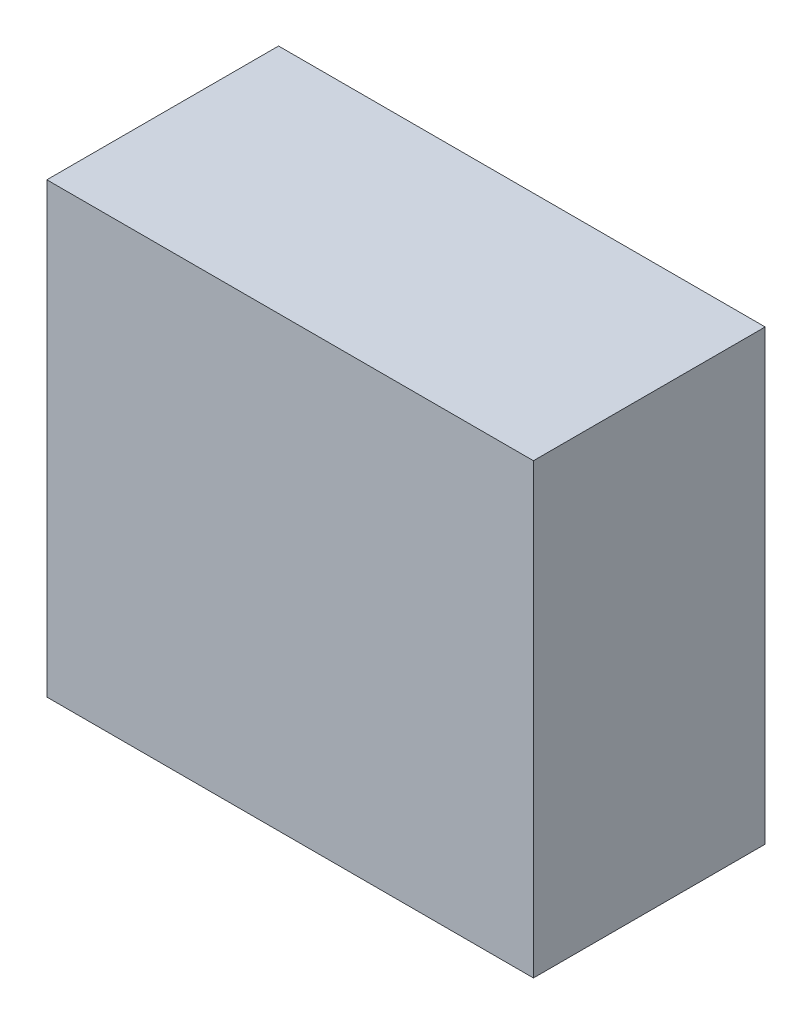
ISO-10303-21;
HEADER;
FILE_DESCRIPTION(('STEP AP214'),'2;1');
FILE_NAME('part.step','',(''),(''),'','','');
FILE_SCHEMA(('AUTOMOTIVE_DESIGN { 1 0 10303 214 1 1 1 1 }'));
ENDSEC;
DATA;
#1=APPLICATION_CONTEXT('core data for automotive mechanical design processes');
#2=APPLICATION_PROTOCOL_DEFINITION('international standard','automotive_design',2000,#1);
#3=PRODUCT_CONTEXT('',#1,'mechanical');
#4=PRODUCT('Part','Part','',(#3));
#5=PRODUCT_RELATED_PRODUCT_CATEGORY('part','',(#4));
#6=PRODUCT_DEFINITION_FORMATION('','',#4);
#7=PRODUCT_DEFINITION_CONTEXT('part definition',#1,'design');
#8=PRODUCT_DEFINITION('design','',#6,#7);
#9=PRODUCT_DEFINITION_SHAPE('','',#8);
#10=(LENGTH_UNIT() NAMED_UNIT(*) SI_UNIT(.MILLI.,.METRE.));
#11=(NAMED_UNIT(*) PLANE_ANGLE_UNIT() SI_UNIT($,.RADIAN.));
#12=(NAMED_UNIT(*) SI_UNIT($,.STERADIAN.) SOLID_ANGLE_UNIT());
#13=UNCERTAINTY_MEASURE_WITH_UNIT(LENGTH_MEASURE(1.E-05),#10,'distance_accuracy_value','');
#14=(GEOMETRIC_REPRESENTATION_CONTEXT(3) GLOBAL_UNCERTAINTY_ASSIGNED_CONTEXT((#13)) GLOBAL_UNIT_ASSIGNED_CONTEXT((#10,
#11,#12)) REPRESENTATION_CONTEXT('',''));
#15=CARTESIAN_POINT('',(0.,0.,0.));
#16=DIRECTION('',(0.,0.,1.));
#17=DIRECTION('',(1.,0.,0.));
#18=AXIS2_PLACEMENT_3D('',#15,#16,#17);
#19=CARTESIAN_POINT('',(31.5,29.,30.));
#20=DIRECTION('',(-1.,0.,0.));
#21=DIRECTION('',(0.,0.,1.));
#22=AXIS2_PLACEMENT_3D('',#19,#20,#21);
#23=PLANE('',#22);
#24=DIRECTION('',(0.,1.,0.));
#25=VECTOR('',#24,1.);
#26=CARTESIAN_POINT('',(31.5,29.,0.));
#27=LINE('',#26,#25);
#28=CARTESIAN_POINT('',(31.5,-29.,0.));
#29=VERTEX_POINT('',#28);
#30=CARTESIAN_POINT('',(31.5,29.,0.));
#31=VERTEX_POINT('',#30);
#32=EDGE_CURVE('E100',#29,#31,#27,.T.);
#33=ORIENTED_EDGE('',*,*,#32,.T.);
#34=DIRECTION('',(0.,0.,-1.));
#35=VECTOR('',#34,1.);
#36=CARTESIAN_POINT('',(31.5,29.,30.));
#37=LINE('',#36,#35);
#38=CARTESIAN_POINT('',(31.5,29.,30.));
#39=VERTEX_POINT('',#38);
#40=EDGE_CURVE('E11',#39,#31,#37,.T.);
#41=ORIENTED_EDGE('',*,*,#40,.F.);
#42=DIRECTION('',(0.,1.,0.));
#43=VECTOR('',#42,1.);
#44=CARTESIAN_POINT('',(31.5,29.,30.));
#45=LINE('',#44,#43);
#46=CARTESIAN_POINT('',(31.5,-29.,30.));
#47=VERTEX_POINT('',#46);
#48=EDGE_CURVE('E88',#47,#39,#45,.T.);
#49=ORIENTED_EDGE('',*,*,#48,.F.);
#50=DIRECTION('',(0.,0.,-1.));
#51=VECTOR('',#50,1.);
#52=CARTESIAN_POINT('',(31.5,-29.,30.));
#53=LINE('',#52,#51);
#54=EDGE_CURVE('E96',#47,#29,#53,.T.);
#55=ORIENTED_EDGE('',*,*,#54,.T.);
#56=EDGE_LOOP('',(#33,#41,#49,#55));
#57=FACE_BOUND('',#56,.T.);
#58=ADVANCED_FACE('F37',(#57),#23,.F.);
#59=CARTESIAN_POINT('',(-31.5,29.,30.));
#60=DIRECTION('',(0.,-1.,0.));
#61=DIRECTION('',(0.,0.,-1.));
#62=AXIS2_PLACEMENT_3D('',#59,#60,#61);
#63=PLANE('',#62);
#64=DIRECTION('',(-1.,0.,0.));
#65=VECTOR('',#64,1.);
#66=CARTESIAN_POINT('',(-31.5,29.,0.));
#67=LINE('',#66,#65);
#68=CARTESIAN_POINT('',(-31.5,29.,0.));
#69=VERTEX_POINT('',#68);
#70=EDGE_CURVE('E92',#31,#69,#67,.T.);
#71=ORIENTED_EDGE('',*,*,#70,.T.);
#72=DIRECTION('',(0.,0.,-1.));
#73=VECTOR('',#72,1.);
#74=CARTESIAN_POINT('',(-31.5,29.,30.));
#75=LINE('',#74,#73);
#76=CARTESIAN_POINT('',(-31.5,29.,30.));
#77=VERTEX_POINT('',#76);
#78=EDGE_CURVE('E45',#77,#69,#75,.T.);
#79=ORIENTED_EDGE('',*,*,#78,.F.);
#80=DIRECTION('',(-1.,0.,0.));
#81=VECTOR('',#80,1.);
#82=CARTESIAN_POINT('',(-31.5,29.,30.));
#83=LINE('',#82,#81);
#84=EDGE_CURVE('E83',#39,#77,#83,.T.);
#85=ORIENTED_EDGE('',*,*,#84,.F.);
#86=ORIENTED_EDGE('',*,*,#40,.T.);
#87=EDGE_LOOP('',(#71,#79,#85,#86));
#88=FACE_BOUND('',#87,.T.);
#89=ADVANCED_FACE('F91',(#88),#63,.F.);
#90=CARTESIAN_POINT('',(-31.5,29.,30.));
#91=DIRECTION('',(1.,0.,0.));
#92=DIRECTION('',(0.,0.,-1.));
#93=AXIS2_PLACEMENT_3D('',#90,#91,#92);
#94=PLANE('',#93);
#95=DIRECTION('',(0.,-1.,0.));
#96=VECTOR('',#95,1.);
#97=CARTESIAN_POINT('',(-31.5,29.,0.));
#98=LINE('',#97,#96);
#99=CARTESIAN_POINT('',(-31.5,-29.,0.));
#100=VERTEX_POINT('',#99);
#101=EDGE_CURVE('E70',#69,#100,#98,.T.);
#102=ORIENTED_EDGE('',*,*,#101,.T.);
#103=DIRECTION('',(0.,0.,-1.));
#104=VECTOR('',#103,1.);
#105=CARTESIAN_POINT('',(-31.5,-29.,30.));
#106=LINE('',#105,#104);
#107=CARTESIAN_POINT('',(-31.5,-29.,30.));
#108=VERTEX_POINT('',#107);
#109=EDGE_CURVE('E93',#108,#100,#106,.T.);
#110=ORIENTED_EDGE('',*,*,#109,.F.);
#111=DIRECTION('',(0.,-1.,0.));
#112=VECTOR('',#111,1.);
#113=CARTESIAN_POINT('',(-31.5,29.,30.));
#114=LINE('',#113,#112);
#115=EDGE_CURVE('E86',#77,#108,#114,.T.);
#116=ORIENTED_EDGE('',*,*,#115,.F.);
#117=ORIENTED_EDGE('',*,*,#78,.T.);
#118=EDGE_LOOP('',(#102,#110,#116,#117));
#119=FACE_BOUND('',#118,.T.);
#120=ADVANCED_FACE('F94',(#119),#94,.F.);
#121=CARTESIAN_POINT('',(-31.5,-29.,30.));
#122=DIRECTION('',(0.,1.,0.));
#123=DIRECTION('',(0.,0.,1.));
#124=AXIS2_PLACEMENT_3D('',#121,#122,#123);
#125=PLANE('',#124);
#126=DIRECTION('',(1.,0.,0.));
#127=VECTOR('',#126,1.);
#128=CARTESIAN_POINT('',(-31.5,-29.,0.));
#129=LINE('',#128,#127);
#130=EDGE_CURVE('E76',#100,#29,#129,.T.);
#131=ORIENTED_EDGE('',*,*,#130,.T.);
#132=ORIENTED_EDGE('',*,*,#54,.F.);
#133=DIRECTION('',(1.,0.,0.));
#134=VECTOR('',#133,1.);
#135=CARTESIAN_POINT('',(-31.5,-29.,30.));
#136=LINE('',#135,#134);
#137=EDGE_CURVE('E53',#108,#47,#136,.T.);
#138=ORIENTED_EDGE('',*,*,#137,.F.);
#139=ORIENTED_EDGE('',*,*,#109,.T.);
#140=EDGE_LOOP('',(#131,#132,#138,#139));
#141=FACE_BOUND('',#140,.T.);
#142=ADVANCED_FACE('F107',(#141),#125,.F.);
#143=CARTESIAN_POINT('',(0.,0.,30.));
#144=DIRECTION('',(0.,0.,1.));
#145=DIRECTION('',(1.,0.,0.));
#146=AXIS2_PLACEMENT_3D('',#143,#144,#145);
#147=PLANE('',#146);
#148=ORIENTED_EDGE('',*,*,#48,.T.);
#149=ORIENTED_EDGE('',*,*,#84,.T.);
#150=ORIENTED_EDGE('',*,*,#115,.T.);
#151=ORIENTED_EDGE('',*,*,#137,.T.);
#152=EDGE_LOOP('',(#148,#149,#150,#151));
#153=FACE_BOUND('',#152,.T.);
#154=ADVANCED_FACE('F84',(#153),#147,.T.);
#155=CARTESIAN_POINT('',(0.,0.,0.));
#156=DIRECTION('',(0.,0.,1.));
#157=DIRECTION('',(1.,0.,0.));
#158=AXIS2_PLACEMENT_3D('',#155,#156,#157);
#159=PLANE('',#158);
#160=ORIENTED_EDGE('',*,*,#32,.F.);
#161=ORIENTED_EDGE('',*,*,#130,.F.);
#162=ORIENTED_EDGE('',*,*,#101,.F.);
#163=ORIENTED_EDGE('',*,*,#70,.F.);
#164=EDGE_LOOP('',(#160,#161,#162,#163));
#165=FACE_BOUND('',#164,.T.);
#166=ADVANCED_FACE('F110',(#165),#159,.F.);
#167=CLOSED_SHELL('',(#58,#89,#120,#142,#154,#166));
#168=MANIFOLD_SOLID_BREP('B2',#167);
#169=ADVANCED_BREP_SHAPE_REPRESENTATION('',(#18,#168),#14);
#170=SHAPE_DEFINITION_REPRESENTATION(#9,#169);
ENDSEC;
END-ISO-10303-21;
